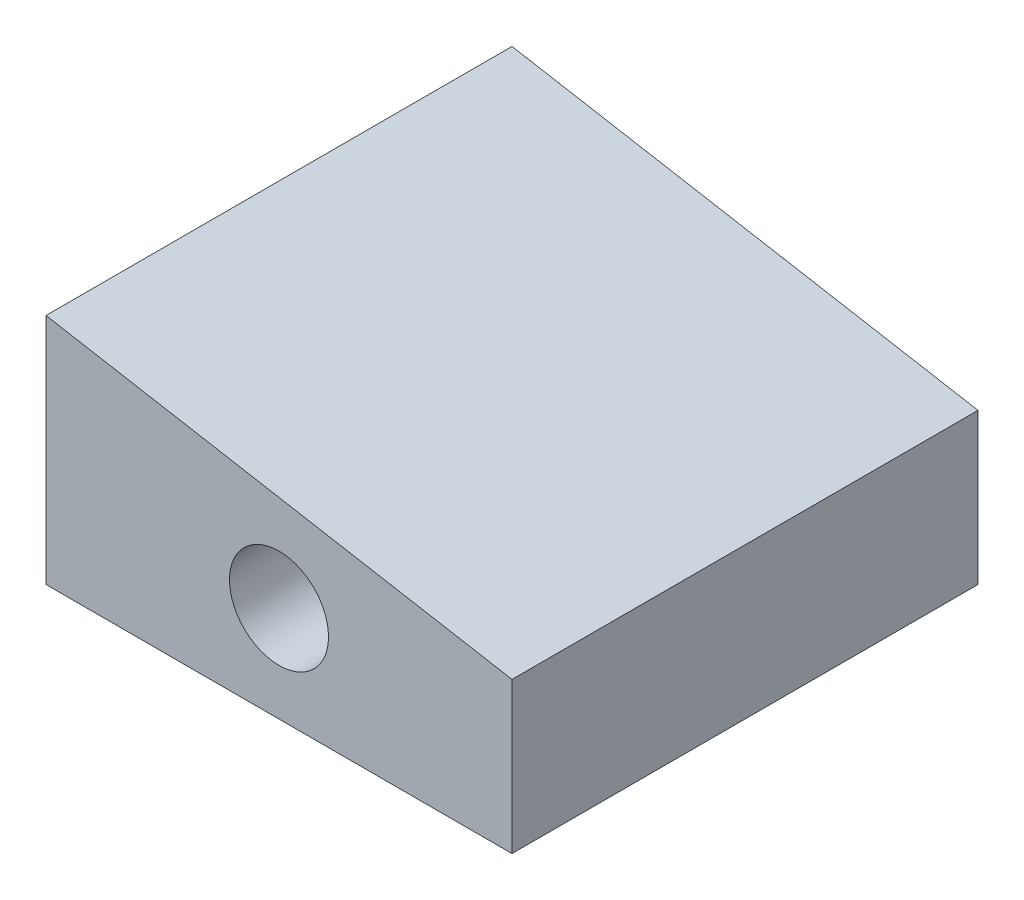
ISO-10303-21;
HEADER;
FILE_DESCRIPTION(('STEP AP214'),'2;1');
FILE_NAME('part.step','',(''),(''),'','','');
FILE_SCHEMA(('AUTOMOTIVE_DESIGN { 1 0 10303 214 1 1 1 1 }'));
ENDSEC;
DATA;
#1=APPLICATION_CONTEXT('core data for automotive mechanical design processes');
#2=APPLICATION_PROTOCOL_DEFINITION('international standard','automotive_design',2000,#1);
#3=PRODUCT_CONTEXT('',#1,'mechanical');
#4=PRODUCT('Part','Part','',(#3));
#5=PRODUCT_RELATED_PRODUCT_CATEGORY('part','',(#4));
#6=PRODUCT_DEFINITION_FORMATION('','',#4);
#7=PRODUCT_DEFINITION_CONTEXT('part definition',#1,'design');
#8=PRODUCT_DEFINITION('design','',#6,#7);
#9=PRODUCT_DEFINITION_SHAPE('','',#8);
#10=(LENGTH_UNIT() NAMED_UNIT(*) SI_UNIT(.MILLI.,.METRE.));
#11=(NAMED_UNIT(*) PLANE_ANGLE_UNIT() SI_UNIT($,.RADIAN.));
#12=(NAMED_UNIT(*) SI_UNIT($,.STERADIAN.) SOLID_ANGLE_UNIT());
#13=UNCERTAINTY_MEASURE_WITH_UNIT(LENGTH_MEASURE(1.E-05),#10,'distance_accuracy_value','');
#14=(GEOMETRIC_REPRESENTATION_CONTEXT(3) GLOBAL_UNCERTAINTY_ASSIGNED_CONTEXT((#13)) GLOBAL_UNIT_ASSIGNED_CONTEXT((#10,
#11,#12)) REPRESENTATION_CONTEXT('',''));
#15=CARTESIAN_POINT('',(0.,0.,0.));
#16=DIRECTION('',(0.,0.,1.));
#17=DIRECTION('',(1.,0.,0.));
#18=AXIS2_PLACEMENT_3D('',#15,#16,#17);
#19=CARTESIAN_POINT('',(0.,0.,20.));
#20=DIRECTION('',(0.,0.,-1.));
#21=DIRECTION('',(-1.,0.,0.));
#22=AXIS2_PLACEMENT_3D('',#19,#20,#21);
#23=PLANE('',#22);
#24=DIRECTION('',(1.,0.,0.));
#25=VECTOR('',#24,1.);
#26=CARTESIAN_POINT('',(20.,0.,20.));
#27=LINE('',#26,#25);
#28=CARTESIAN_POINT('',(0.,0.,20.));
#29=VERTEX_POINT('',#28);
#30=CARTESIAN_POINT('',(20.,0.,20.));
#31=VERTEX_POINT('',#30);
#32=EDGE_CURVE('E86',#29,#31,#27,.T.);
#33=ORIENTED_EDGE('',*,*,#32,.T.);
#34=DIRECTION('',(0.,1.,0.));
#35=VECTOR('',#34,1.);
#36=CARTESIAN_POINT('',(20.,6.47346038583085,20.));
#37=LINE('',#36,#35);
#38=CARTESIAN_POINT('',(20.,6.47346038583085,20.));
#39=VERTEX_POINT('',#38);
#40=EDGE_CURVE('E81',#31,#39,#37,.T.);
#41=ORIENTED_EDGE('',*,*,#40,.T.);
#42=DIRECTION('',(-0.984807753012209,0.173648177666923,0.));
#43=VECTOR('',#42,1.);
#44=CARTESIAN_POINT('',(0.,10.,20.));
#45=LINE('',#44,#43);
#46=CARTESIAN_POINT('',(0.,10.,20.));
#47=VERTEX_POINT('',#46);
#48=EDGE_CURVE('E84',#39,#47,#45,.T.);
#49=ORIENTED_EDGE('',*,*,#48,.T.);
#50=DIRECTION('',(0.,-1.,0.));
#51=VECTOR('',#50,1.);
#52=CARTESIAN_POINT('',(0.,0.,20.));
#53=LINE('',#52,#51);
#54=EDGE_CURVE('E51',#47,#29,#53,.T.);
#55=ORIENTED_EDGE('',*,*,#54,.T.);
#56=EDGE_LOOP('',(#33,#41,#49,#55));
#57=FACE_BOUND('',#56,.T.);
#58=CARTESIAN_POINT('',(10.,4.11836509645771,20.));
#59=DIRECTION('',(0.,0.,1.));
#60=DIRECTION('',(1.,0.,0.));
#61=AXIS2_PLACEMENT_3D('',#58,#59,#60);
#62=CIRCLE('',#61,2.125);
#63=CARTESIAN_POINT('',(12.125,4.11836509645771,20.));
#64=VERTEX_POINT('',#63);
#65=EDGE_CURVE('E101',#64,#64,#62,.T.);
#66=ORIENTED_EDGE('',*,*,#65,.F.);
#67=EDGE_LOOP('',(#66));
#68=FACE_BOUND('',#67,.T.);
#69=ADVANCED_FACE('F34',(#57,#68),#23,.F.);
#70=CARTESIAN_POINT('',(0.,0.,0.));
#71=DIRECTION('',(0.,0.,-1.));
#72=DIRECTION('',(-1.,0.,0.));
#73=AXIS2_PLACEMENT_3D('',#70,#71,#72);
#74=PLANE('',#73);
#75=DIRECTION('',(1.,0.,0.));
#76=VECTOR('',#75,1.);
#77=CARTESIAN_POINT('',(20.,0.,0.));
#78=LINE('',#77,#76);
#79=CARTESIAN_POINT('',(0.,0.,0.));
#80=VERTEX_POINT('',#79);
#81=CARTESIAN_POINT('',(20.,0.,0.));
#82=VERTEX_POINT('',#81);
#83=EDGE_CURVE('E98',#80,#82,#78,.T.);
#84=ORIENTED_EDGE('',*,*,#83,.F.);
#85=DIRECTION('',(0.,-1.,0.));
#86=VECTOR('',#85,1.);
#87=CARTESIAN_POINT('',(0.,0.,0.));
#88=LINE('',#87,#86);
#89=CARTESIAN_POINT('',(0.,10.,0.));
#90=VERTEX_POINT('',#89);
#91=EDGE_CURVE('E74',#90,#80,#88,.T.);
#92=ORIENTED_EDGE('',*,*,#91,.F.);
#93=DIRECTION('',(-0.984807753012209,0.173648177666923,0.));
#94=VECTOR('',#93,1.);
#95=CARTESIAN_POINT('',(0.,10.,0.));
#96=LINE('',#95,#94);
#97=CARTESIAN_POINT('',(20.,6.47346038583085,0.));
#98=VERTEX_POINT('',#97);
#99=EDGE_CURVE('E68',#98,#90,#96,.T.);
#100=ORIENTED_EDGE('',*,*,#99,.F.);
#101=DIRECTION('',(0.,1.,0.));
#102=VECTOR('',#101,1.);
#103=CARTESIAN_POINT('',(20.,6.47346038583085,0.));
#104=LINE('',#103,#102);
#105=EDGE_CURVE('E90',#82,#98,#104,.T.);
#106=ORIENTED_EDGE('',*,*,#105,.F.);
#107=EDGE_LOOP('',(#84,#92,#100,#106));
#108=FACE_BOUND('',#107,.T.);
#109=CARTESIAN_POINT('',(10.,4.11836509645771,0.));
#110=DIRECTION('',(0.,0.,1.));
#111=DIRECTION('',(1.,0.,0.));
#112=AXIS2_PLACEMENT_3D('',#109,#110,#111);
#113=CIRCLE('',#112,2.125);
#114=CARTESIAN_POINT('',(12.125,4.11836509645771,0.));
#115=VERTEX_POINT('',#114);
#116=EDGE_CURVE('E113',#115,#115,#113,.T.);
#117=ORIENTED_EDGE('',*,*,#116,.T.);
#118=EDGE_LOOP('',(#117));
#119=FACE_BOUND('',#118,.T.);
#120=ADVANCED_FACE('F109',(#108,#119),#74,.T.);
#121=CARTESIAN_POINT('',(20.,0.,20.));
#122=DIRECTION('',(0.,1.,0.));
#123=DIRECTION('',(-1.,0.,0.));
#124=AXIS2_PLACEMENT_3D('',#121,#122,#123);
#125=PLANE('',#124);
#126=ORIENTED_EDGE('',*,*,#83,.T.);
#127=DIRECTION('',(0.,0.,-1.));
#128=VECTOR('',#127,1.);
#129=CARTESIAN_POINT('',(20.,0.,20.));
#130=LINE('',#129,#128);
#131=EDGE_CURVE('E11',#31,#82,#130,.T.);
#132=ORIENTED_EDGE('',*,*,#131,.F.);
#133=ORIENTED_EDGE('',*,*,#32,.F.);
#134=DIRECTION('',(0.,0.,-1.));
#135=VECTOR('',#134,1.);
#136=CARTESIAN_POINT('',(0.,0.,20.));
#137=LINE('',#136,#135);
#138=EDGE_CURVE('E94',#29,#80,#137,.T.);
#139=ORIENTED_EDGE('',*,*,#138,.T.);
#140=EDGE_LOOP('',(#126,#132,#133,#139));
#141=FACE_BOUND('',#140,.T.);
#142=ADVANCED_FACE('F36',(#141),#125,.F.);
#143=CARTESIAN_POINT('',(20.,6.47346038583085,20.));
#144=DIRECTION('',(-1.,0.,0.));
#145=DIRECTION('',(0.,-1.,0.));
#146=AXIS2_PLACEMENT_3D('',#143,#144,#145);
#147=PLANE('',#146);
#148=ORIENTED_EDGE('',*,*,#105,.T.);
#149=DIRECTION('',(0.,0.,-1.));
#150=VECTOR('',#149,1.);
#151=CARTESIAN_POINT('',(20.,6.47346038583085,20.));
#152=LINE('',#151,#150);
#153=EDGE_CURVE('E43',#39,#98,#152,.T.);
#154=ORIENTED_EDGE('',*,*,#153,.F.);
#155=ORIENTED_EDGE('',*,*,#40,.F.);
#156=ORIENTED_EDGE('',*,*,#131,.T.);
#157=EDGE_LOOP('',(#148,#154,#155,#156));
#158=FACE_BOUND('',#157,.T.);
#159=ADVANCED_FACE('F89',(#158),#147,.F.);
#160=CARTESIAN_POINT('',(0.,10.,20.));
#161=DIRECTION('',(-0.173648177666923,-0.984807753012209,0.));
#162=DIRECTION('',(0.984807753012209,-0.173648177666923,0.));
#163=AXIS2_PLACEMENT_3D('',#160,#161,#162);
#164=PLANE('',#163);
#165=ORIENTED_EDGE('',*,*,#99,.T.);
#166=DIRECTION('',(0.,0.,-1.));
#167=VECTOR('',#166,1.);
#168=CARTESIAN_POINT('',(0.,10.,20.));
#169=LINE('',#168,#167);
#170=EDGE_CURVE('E91',#47,#90,#169,.T.);
#171=ORIENTED_EDGE('',*,*,#170,.F.);
#172=ORIENTED_EDGE('',*,*,#48,.F.);
#173=ORIENTED_EDGE('',*,*,#153,.T.);
#174=EDGE_LOOP('',(#165,#171,#172,#173));
#175=FACE_BOUND('',#174,.T.);
#176=ADVANCED_FACE('F92',(#175),#164,.F.);
#177=CARTESIAN_POINT('',(0.,0.,20.));
#178=DIRECTION('',(1.,0.,0.));
#179=DIRECTION('',(0.,0.,-1.));
#180=AXIS2_PLACEMENT_3D('',#177,#178,#179);
#181=PLANE('',#180);
#182=ORIENTED_EDGE('',*,*,#91,.T.);
#183=ORIENTED_EDGE('',*,*,#138,.F.);
#184=ORIENTED_EDGE('',*,*,#54,.F.);
#185=ORIENTED_EDGE('',*,*,#170,.T.);
#186=EDGE_LOOP('',(#182,#183,#184,#185));
#187=FACE_BOUND('',#186,.T.);
#188=ADVANCED_FACE('F106',(#187),#181,.F.);
#189=CARTESIAN_POINT('',(10.,4.11836509645771,20.));
#190=DIRECTION('',(0.,0.,-1.));
#191=DIRECTION('',(-1.,0.,0.));
#192=AXIS2_PLACEMENT_3D('',#189,#190,#191);
#193=CYLINDRICAL_SURFACE('',#192,2.125);
#194=ORIENTED_EDGE('',*,*,#65,.T.);
#195=EDGE_LOOP('',(#194));
#196=FACE_BOUND('',#195,.T.);
#197=ORIENTED_EDGE('',*,*,#116,.F.);
#198=EDGE_LOOP('',(#197));
#199=FACE_BOUND('',#198,.T.);
#200=ADVANCED_FACE('F119',(#196,#199),#193,.F.);
#201=CLOSED_SHELL('',(#69,#120,#142,#159,#176,#188,#200));
#202=MANIFOLD_SOLID_BREP('B2',#201);
#203=ADVANCED_BREP_SHAPE_REPRESENTATION('',(#18,#202),#14);
#204=SHAPE_DEFINITION_REPRESENTATION(#9,#203);
ENDSEC;
END-ISO-10303-21;
